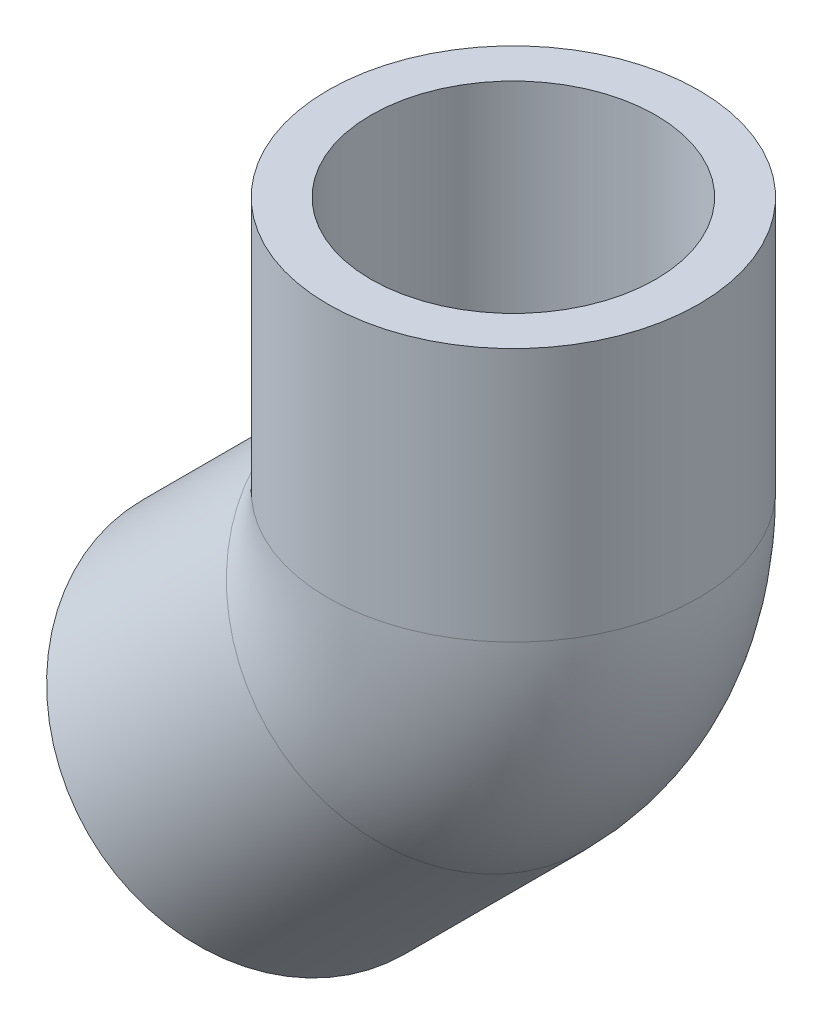
ISO-10303-21;
HEADER;
FILE_DESCRIPTION(('STEP AP214'),'2;1');
FILE_NAME('part.step','',(''),(''),'','','');
FILE_SCHEMA(('AUTOMOTIVE_DESIGN { 1 0 10303 214 1 1 1 1 }'));
ENDSEC;
DATA;
#1=APPLICATION_CONTEXT('core data for automotive mechanical design processes');
#2=APPLICATION_PROTOCOL_DEFINITION('international standard','automotive_design',2000,#1);
#3=PRODUCT_CONTEXT('',#1,'mechanical');
#4=PRODUCT('Part','Part','',(#3));
#5=PRODUCT_RELATED_PRODUCT_CATEGORY('part','',(#4));
#6=PRODUCT_DEFINITION_FORMATION('','',#4);
#7=PRODUCT_DEFINITION_CONTEXT('part definition',#1,'design');
#8=PRODUCT_DEFINITION('design','',#6,#7);
#9=PRODUCT_DEFINITION_SHAPE('','',#8);
#10=(LENGTH_UNIT() NAMED_UNIT(*) SI_UNIT(.MILLI.,.METRE.));
#11=(NAMED_UNIT(*) PLANE_ANGLE_UNIT() SI_UNIT($,.RADIAN.));
#12=(NAMED_UNIT(*) SI_UNIT($,.STERADIAN.) SOLID_ANGLE_UNIT());
#13=UNCERTAINTY_MEASURE_WITH_UNIT(LENGTH_MEASURE(1.E-05),#10,'distance_accuracy_value','');
#14=(GEOMETRIC_REPRESENTATION_CONTEXT(3) GLOBAL_UNCERTAINTY_ASSIGNED_CONTEXT((#13)) GLOBAL_UNIT_ASSIGNED_CONTEXT((#10,
#11,#12)) REPRESENTATION_CONTEXT('',''));
#15=CARTESIAN_POINT('',(0.,0.,0.));
#16=DIRECTION('',(0.,0.,1.));
#17=DIRECTION('',(1.,0.,0.));
#18=AXIS2_PLACEMENT_3D('',#15,#16,#17);
#19=CARTESIAN_POINT('',(0.,25.4,0.));
#20=DIRECTION('',(0.,-1.,0.));
#21=DIRECTION('',(0.,0.,-1.));
#22=AXIS2_PLACEMENT_3D('',#19,#20,#21);
#23=CYLINDRICAL_SURFACE('',#22,13.8938);
#24=CARTESIAN_POINT('',(0.,6.35,0.));
#25=DIRECTION('',(0.,1.,0.));
#26=DIRECTION('',(0.,0.,1.));
#27=AXIS2_PLACEMENT_3D('',#24,#25,#26);
#28=CIRCLE('',#27,13.8938);
#29=CARTESIAN_POINT('',(13.8938,6.35000000000001,0.));
#30=VERTEX_POINT('',#29);
#31=EDGE_CURVE('E58',#30,#30,#28,.T.);
#32=ORIENTED_EDGE('',*,*,#31,.T.);
#33=EDGE_LOOP('',(#32));
#34=FACE_BOUND('',#33,.T.);
#35=CARTESIAN_POINT('',(0.,25.4,0.));
#36=DIRECTION('',(0.,1.,0.));
#37=DIRECTION('',(0.,0.,1.));
#38=AXIS2_PLACEMENT_3D('',#35,#36,#37);
#39=CIRCLE('',#38,13.8938);
#40=CARTESIAN_POINT('',(0.,25.4,13.8938));
#41=VERTEX_POINT('',#40);
#42=EDGE_CURVE('E48',#41,#41,#39,.T.);
#43=ORIENTED_EDGE('',*,*,#42,.F.);
#44=EDGE_LOOP('',(#43));
#45=FACE_BOUND('',#44,.T.);
#46=ADVANCED_FACE('F39',(#34,#45),#23,.T.);
#47=CARTESIAN_POINT('',(-15.3302561210694,6.35,0.));
#48=DIRECTION('',(0.,0.,-1.));
#49=DIRECTION('',(-1.,0.,0.));
#50=AXIS2_PLACEMENT_3D('',#47,#48,#49);
#51=TOROIDAL_SURFACE('',#50,15.3302561210694,13.8938);
#52=CARTESIAN_POINT('',(-4.49012806053454,-4.49012806053462,0.));
#53=DIRECTION('',(0.707106781186541,0.707106781186554,0.));
#54=DIRECTION('',(0.,0.,1.));
#55=AXIS2_PLACEMENT_3D('',#52,#53,#54);
#56=CIRCLE('',#55,13.8938);
#57=CARTESIAN_POINT('',(5.33427213591521,-14.3145282569842,0.));
#58=VERTEX_POINT('',#57);
#59=EDGE_CURVE('E43',#58,#58,#56,.T.);
#60=CARTESIAN_POINT('',(-15.3302561210694,6.35,0.));
#61=DIRECTION('',(0.,0.,-1.));
#62=DIRECTION('',(-1.,0.,0.));
#63=AXIS2_PLACEMENT_3D('',#60,#61,#62);
#64=CIRCLE('',#63,29.2240561210694);
#65=EDGE_CURVE('',#30,#58,#64,.T.);
#66=ORIENTED_EDGE('',*,*,#31,.F.);
#67=ORIENTED_EDGE('',*,*,#59,.T.);
#68=ORIENTED_EDGE('',*,*,#65,.T.);
#69=ORIENTED_EDGE('',*,*,#65,.F.);
#70=EDGE_LOOP('',(#66,#68,#67,#69));
#71=FACE_BOUND('',#70,.T.);
#72=ADVANCED_FACE('F119',(#71),#51,.T.);
#73=CARTESIAN_POINT('',(-4.49012806053453,-4.49012806053462,0.));
#74=DIRECTION('',(-0.707106781186541,-0.707106781186554,0.));
#75=DIRECTION('',(0.707106781186554,-0.707106781186541,0.));
#76=AXIS2_PLACEMENT_3D('',#73,#74,#75);
#77=CYLINDRICAL_SURFACE('',#76,13.8938);
#78=CARTESIAN_POINT('',(-17.9605122421381,-17.9605122421385,0.));
#79=DIRECTION('',(0.707106781186541,0.707106781186554,0.));
#80=DIRECTION('',(0.,0.,1.));
#81=AXIS2_PLACEMENT_3D('',#78,#79,#80);
#82=CIRCLE('',#81,13.8938);
#83=CARTESIAN_POINT('',(-17.9605122421381,-17.9605122421385,13.8938));
#84=VERTEX_POINT('',#83);
#85=EDGE_CURVE('E10',#84,#84,#82,.T.);
#86=ORIENTED_EDGE('',*,*,#85,.T.);
#87=EDGE_LOOP('',(#86));
#88=FACE_BOUND('',#87,.T.);
#89=ORIENTED_EDGE('',*,*,#59,.F.);
#90=EDGE_LOOP('',(#89));
#91=FACE_BOUND('',#90,.T.);
#92=ADVANCED_FACE('F41',(#88,#91),#77,.T.);
#93=CARTESIAN_POINT('',(0.,25.4,0.));
#94=DIRECTION('',(0.,1.,0.));
#95=DIRECTION('',(0.,0.,1.));
#96=AXIS2_PLACEMENT_3D('',#93,#94,#95);
#97=PLANE('',#96);
#98=CARTESIAN_POINT('',(0.,25.4,0.));
#99=DIRECTION('',(0.,1.,0.));
#100=DIRECTION('',(0.,0.,1.));
#101=AXIS2_PLACEMENT_3D('',#98,#99,#100);
#102=CIRCLE('',#101,10.668);
#103=CARTESIAN_POINT('',(0.,25.4,10.668));
#104=VERTEX_POINT('',#103);
#105=EDGE_CURVE('E72',#104,#104,#102,.T.);
#106=ORIENTED_EDGE('',*,*,#105,.F.);
#107=EDGE_LOOP('',(#106));
#108=FACE_BOUND('',#107,.T.);
#109=ORIENTED_EDGE('',*,*,#42,.T.);
#110=EDGE_LOOP('',(#109));
#111=FACE_BOUND('',#110,.T.);
#112=ADVANCED_FACE('F105',(#108,#111),#97,.T.);
#113=CARTESIAN_POINT('',(-17.9605122421381,-17.9605122421385,0.));
#114=DIRECTION('',(0.707106781186541,0.707106781186554,0.));
#115=DIRECTION('',(0.,0.,1.));
#116=AXIS2_PLACEMENT_3D('',#113,#114,#115);
#117=PLANE('',#116);
#118=CARTESIAN_POINT('',(-17.9605122421381,-17.9605122421385,0.));
#119=DIRECTION('',(-0.707106781186541,-0.707106781186554,0.));
#120=DIRECTION('',(0.707106781186554,-0.707106781186541,0.));
#121=AXIS2_PLACEMENT_3D('',#118,#119,#120);
#122=CIRCLE('',#121,10.668);
#123=CARTESIAN_POINT('',(-10.41709710044,-25.5039273838365,0.));
#124=VERTEX_POINT('',#123);
#125=EDGE_CURVE('E84',#124,#124,#122,.T.);
#126=ORIENTED_EDGE('',*,*,#125,.F.);
#127=EDGE_LOOP('',(#126));
#128=FACE_BOUND('',#127,.T.);
#129=ORIENTED_EDGE('',*,*,#85,.F.);
#130=EDGE_LOOP('',(#129));
#131=FACE_BOUND('',#130,.T.);
#132=ADVANCED_FACE('F101',(#128,#131),#117,.F.);
#133=CARTESIAN_POINT('',(-15.3302561210694,6.35,0.));
#134=DIRECTION('',(0.,0.,-1.));
#135=DIRECTION('',(-1.,0.,0.));
#136=AXIS2_PLACEMENT_3D('',#133,#134,#135);
#137=TOROIDAL_SURFACE('',#136,15.3302561210694,7.8994);
#138=CARTESIAN_POINT('',(0.,6.35,0.));
#139=DIRECTION('',(0.,1.,0.));
#140=DIRECTION('',(0.,0.,1.));
#141=AXIS2_PLACEMENT_3D('',#138,#139,#140);
#142=CIRCLE('',#141,7.8994);
#143=CARTESIAN_POINT('',(7.8994,6.35,0.));
#144=VERTEX_POINT('',#143);
#145=EDGE_CURVE('E56',#144,#144,#142,.F.);
#146=CARTESIAN_POINT('',(-4.49012806053454,-4.49012806053463,0.));
#147=DIRECTION('',(-0.707106781186541,-0.707106781186554,0.));
#148=DIRECTION('',(0.707106781186554,-0.707106781186541,0.));
#149=AXIS2_PLACEMENT_3D('',#146,#147,#148);
#150=CIRCLE('',#149,7.8994);
#151=CARTESIAN_POINT('',(1.09559124677053,-10.0758473678396,0.));
#152=VERTEX_POINT('',#151);
#153=EDGE_CURVE('E78',#152,#152,#150,.F.);
#154=CARTESIAN_POINT('',(-15.3302561210694,6.35,0.));
#155=DIRECTION('',(0.,0.,-1.));
#156=DIRECTION('',(-1.,0.,0.));
#157=AXIS2_PLACEMENT_3D('',#154,#155,#156);
#158=CIRCLE('',#157,23.2296561210694);
#159=EDGE_CURVE('',#144,#152,#158,.T.);
#160=ORIENTED_EDGE('',*,*,#145,.F.);
#161=ORIENTED_EDGE('',*,*,#153,.F.);
#162=ORIENTED_EDGE('',*,*,#159,.T.);
#163=ORIENTED_EDGE('',*,*,#159,.F.);
#164=EDGE_LOOP('',(#160,#162,#161,#163));
#165=FACE_BOUND('',#164,.T.);
#166=ADVANCED_FACE('F104',(#165),#137,.F.);
#167=CARTESIAN_POINT('',(0.,6.35,0.));
#168=DIRECTION('',(0.,1.,0.));
#169=DIRECTION('',(0.,0.,1.));
#170=AXIS2_PLACEMENT_3D('',#167,#168,#169);
#171=PLANE('',#170);
#172=CARTESIAN_POINT('',(0.,6.35,0.));
#173=DIRECTION('',(0.,1.,0.));
#174=DIRECTION('',(0.,0.,1.));
#175=AXIS2_PLACEMENT_3D('',#172,#173,#174);
#176=CIRCLE('',#175,10.668);
#177=CARTESIAN_POINT('',(0.,6.35,10.668));
#178=VERTEX_POINT('',#177);
#179=EDGE_CURVE('E67',#178,#178,#176,.T.);
#180=ORIENTED_EDGE('',*,*,#179,.T.);
#181=EDGE_LOOP('',(#180));
#182=FACE_BOUND('',#181,.T.);
#183=ORIENTED_EDGE('',*,*,#145,.T.);
#184=EDGE_LOOP('',(#183));
#185=FACE_BOUND('',#184,.T.);
#186=ADVANCED_FACE('F111',(#182,#185),#171,.T.);
#187=CARTESIAN_POINT('',(0.,6.35,0.));
#188=DIRECTION('',(0.,1.,0.));
#189=DIRECTION('',(0.,0.,1.));
#190=AXIS2_PLACEMENT_3D('',#187,#188,#189);
#191=CYLINDRICAL_SURFACE('',#190,10.668);
#192=CARTESIAN_POINT('',(0.,6.35,10.668));
#193=CARTESIAN_POINT('',(0.,6.5484375,10.668));
#194=CARTESIAN_POINT('',(0.,6.746875,10.668));
#195=CARTESIAN_POINT('',(0.,7.14375,10.668));
#196=CARTESIAN_POINT('',(0.,7.3421875,10.668));
#197=CARTESIAN_POINT('',(0.,7.7390625,10.668));
#198=CARTESIAN_POINT('',(0.,7.9375,10.668));
#199=CARTESIAN_POINT('',(0.,8.334375,10.668));
#200=CARTESIAN_POINT('',(0.,8.5328125,10.668));
#201=CARTESIAN_POINT('',(0.,8.9296875,10.668));
#202=CARTESIAN_POINT('',(0.,9.128125,10.668));
#203=CARTESIAN_POINT('',(0.,9.525,10.668));
#204=CARTESIAN_POINT('',(0.,9.7234375,10.668));
#205=CARTESIAN_POINT('',(0.,10.1203125,10.668));
#206=CARTESIAN_POINT('',(0.,10.31875,10.668));
#207=CARTESIAN_POINT('',(0.,10.715625,10.668));
#208=CARTESIAN_POINT('',(0.,10.9140625,10.668));
#209=CARTESIAN_POINT('',(0.,11.3109375,10.668));
#210=CARTESIAN_POINT('',(0.,11.509375,10.668));
#211=CARTESIAN_POINT('',(0.,11.90625,10.668));
#212=CARTESIAN_POINT('',(0.,12.1046875,10.668));
#213=CARTESIAN_POINT('',(0.,12.5015625,10.668));
#214=CARTESIAN_POINT('',(0.,12.7,10.668));
#215=CARTESIAN_POINT('',(0.,13.096875,10.668));
#216=CARTESIAN_POINT('',(0.,13.2953125,10.668));
#217=CARTESIAN_POINT('',(0.,13.6921875,10.668));
#218=CARTESIAN_POINT('',(0.,13.890625,10.668));
#219=CARTESIAN_POINT('',(0.,14.2875,10.668));
#220=CARTESIAN_POINT('',(0.,14.4859375,10.668));
#221=CARTESIAN_POINT('',(0.,14.8828125,10.668));
#222=CARTESIAN_POINT('',(0.,15.08125,10.668));
#223=CARTESIAN_POINT('',(0.,15.478125,10.668));
#224=CARTESIAN_POINT('',(0.,15.6765625,10.668));
#225=CARTESIAN_POINT('',(0.,16.0734375,10.668));
#226=CARTESIAN_POINT('',(0.,16.271875,10.668));
#227=CARTESIAN_POINT('',(0.,16.66875,10.668));
#228=CARTESIAN_POINT('',(0.,16.8671875,10.668));
#229=CARTESIAN_POINT('',(0.,17.2640625,10.668));
#230=CARTESIAN_POINT('',(0.,17.4625,10.668));
#231=CARTESIAN_POINT('',(0.,17.859375,10.668));
#232=CARTESIAN_POINT('',(0.,18.0578125,10.668));
#233=CARTESIAN_POINT('',(0.,18.4546875,10.668));
#234=CARTESIAN_POINT('',(0.,18.653125,10.668));
#235=CARTESIAN_POINT('',(0.,19.05,10.668));
#236=CARTESIAN_POINT('',(0.,19.2484375,10.668));
#237=CARTESIAN_POINT('',(0.,19.6453125,10.668));
#238=CARTESIAN_POINT('',(0.,19.84375,10.668));
#239=CARTESIAN_POINT('',(0.,20.240625,10.668));
#240=CARTESIAN_POINT('',(0.,20.4390625,10.668));
#241=CARTESIAN_POINT('',(0.,20.8359375,10.668));
#242=CARTESIAN_POINT('',(0.,21.034375,10.668));
#243=CARTESIAN_POINT('',(0.,21.43125,10.668));
#244=CARTESIAN_POINT('',(0.,21.6296875,10.668));
#245=CARTESIAN_POINT('',(0.,22.0265625,10.668));
#246=CARTESIAN_POINT('',(0.,22.225,10.668));
#247=CARTESIAN_POINT('',(0.,22.621875,10.668));
#248=CARTESIAN_POINT('',(0.,22.8203125,10.668));
#249=CARTESIAN_POINT('',(0.,23.2171875,10.668));
#250=CARTESIAN_POINT('',(0.,23.415625,10.668));
#251=CARTESIAN_POINT('',(0.,23.8125,10.668));
#252=CARTESIAN_POINT('',(0.,24.0109375,10.668));
#253=CARTESIAN_POINT('',(0.,24.4078125,10.668));
#254=CARTESIAN_POINT('',(0.,24.60625,10.668));
#255=CARTESIAN_POINT('',(0.,25.003125,10.668));
#256=CARTESIAN_POINT('',(0.,25.2015625,10.668));
#257=CARTESIAN_POINT('',(0.,25.4,10.668));
#258=B_SPLINE_CURVE_WITH_KNOTS('',3,(#192,#193,#194,#195,#196,#197,#198,#199,#200,#201,#202,
#203,#204,#205,#206,#207,#208,#209,#210,#211,#212,#213,#214,#215,#216,#217,#218,#219,#220,#221,
#222,#223,#224,#225,#226,#227,#228,#229,#230,#231,#232,#233,#234,#235,#236,#237,#238,#239,#240,
#241,#242,#243,#244,#245,#246,#247,#248,#249,#250,#251,#252,#253,#254,#255,#256,#257),
.UNSPECIFIED.,.F.,.F.,(4,2,2,2,2,2,2,2,2,2,2,2,2,2,2,2,2,2,2,2,2,2,2,2,2,2,2,2,2,2,2,2,4),(0.,
0.595312499999999,1.190625,1.7859375,2.38125,2.9765625,3.571875,4.1671875,4.7625,5.3578125,
5.953125,6.5484375,7.14375,7.7390625,8.334375,8.9296875,9.525,10.1203125,10.715625,11.3109375,
11.90625,12.5015625,13.096875,13.6921875,14.2875,14.8828125,15.478125,16.0734375,16.66875,
17.2640625,17.859375,18.4546875,19.05),.UNSPECIFIED.);
#259=EDGE_CURVE('BSEAM147',#178,#104,#258,.T.);
#260=ORIENTED_EDGE('',*,*,#179,.F.);
#261=ORIENTED_EDGE('',*,*,#105,.T.);
#262=ORIENTED_EDGE('',*,*,#259,.T.);
#263=ORIENTED_EDGE('',*,*,#259,.F.);
#264=EDGE_LOOP('',(#260,#262,#261,#263));
#265=FACE_BOUND('',#264,.T.);
#266=ADVANCED_FACE('F147',(#265),#191,.F.);
#267=CARTESIAN_POINT('',(-4.49012806053454,-4.49012806053462,0.));
#268=DIRECTION('',(-0.707106781186541,-0.707106781186554,0.));
#269=DIRECTION('',(0.707106781186554,-0.707106781186541,0.));
#270=AXIS2_PLACEMENT_3D('',#267,#268,#269);
#271=PLANE('',#270);
#272=CARTESIAN_POINT('',(-4.49012806053454,-4.49012806053462,0.));
#273=DIRECTION('',(-0.707106781186541,-0.707106781186554,0.));
#274=DIRECTION('',(0.707106781186554,-0.707106781186541,0.));
#275=AXIS2_PLACEMENT_3D('',#272,#273,#274);
#276=CIRCLE('',#275,10.668);
#277=CARTESIAN_POINT('',(3.05328708116362,-12.0335432022326,0.));
#278=VERTEX_POINT('',#277);
#279=EDGE_CURVE('E83',#278,#278,#276,.T.);
#280=ORIENTED_EDGE('',*,*,#279,.T.);
#281=EDGE_LOOP('',(#280));
#282=FACE_BOUND('',#281,.T.);
#283=ORIENTED_EDGE('',*,*,#153,.T.);
#284=EDGE_LOOP('',(#283));
#285=FACE_BOUND('',#284,.T.);
#286=ADVANCED_FACE('F92',(#282,#285),#271,.T.);
#287=CARTESIAN_POINT('',(-4.49012806053454,-4.49012806053462,0.));
#288=DIRECTION('',(-0.707106781186541,-0.707106781186554,0.));
#289=DIRECTION('',(0.707106781186554,-0.707106781186541,0.));
#290=AXIS2_PLACEMENT_3D('',#287,#288,#289);
#291=CYLINDRICAL_SURFACE('',#290,10.668);
#292=ORIENTED_EDGE('',*,*,#279,.F.);
#293=EDGE_LOOP('',(#292));
#294=FACE_BOUND('',#293,.T.);
#295=ORIENTED_EDGE('',*,*,#125,.T.);
#296=EDGE_LOOP('',(#295));
#297=FACE_BOUND('',#296,.T.);
#298=ADVANCED_FACE('F95',(#294,#297),#291,.F.);
#299=CLOSED_SHELL('',(#46,#72,#92,#112,#132,#166,#186,#266,#286,#298));
#300=MANIFOLD_SOLID_BREP('B2',#299);
#301=ADVANCED_BREP_SHAPE_REPRESENTATION('',(#18,#300),#14);
#302=SHAPE_DEFINITION_REPRESENTATION(#9,#301);
ENDSEC;
END-ISO-10303-21;
